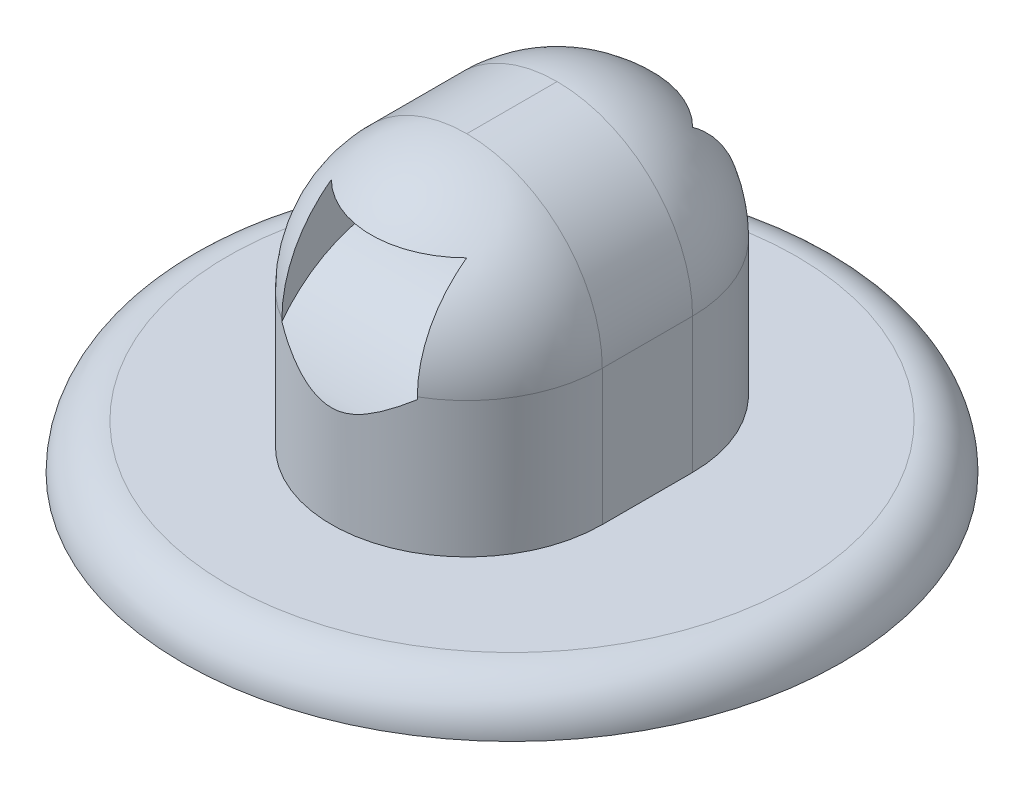
ISO-10303-21;
HEADER;
FILE_DESCRIPTION(('STEP AP214'),'2;1');
FILE_NAME('part.step','',(''),(''),'','','');
FILE_SCHEMA(('AUTOMOTIVE_DESIGN { 1 0 10303 214 1 1 1 1 }'));
ENDSEC;
DATA;
#1=APPLICATION_CONTEXT('core data for automotive mechanical design processes');
#2=APPLICATION_PROTOCOL_DEFINITION('international standard','automotive_design',2000,#1);
#3=PRODUCT_CONTEXT('',#1,'mechanical');
#4=PRODUCT('Part','Part','',(#3));
#5=PRODUCT_RELATED_PRODUCT_CATEGORY('part','',(#4));
#6=PRODUCT_DEFINITION_FORMATION('','',#4);
#7=PRODUCT_DEFINITION_CONTEXT('part definition',#1,'design');
#8=PRODUCT_DEFINITION('design','',#6,#7);
#9=PRODUCT_DEFINITION_SHAPE('','',#8);
#10=(LENGTH_UNIT() NAMED_UNIT(*) SI_UNIT(.MILLI.,.METRE.));
#11=(NAMED_UNIT(*) PLANE_ANGLE_UNIT() SI_UNIT($,.RADIAN.));
#12=(NAMED_UNIT(*) SI_UNIT($,.STERADIAN.) SOLID_ANGLE_UNIT());
#13=UNCERTAINTY_MEASURE_WITH_UNIT(LENGTH_MEASURE(1.E-05),#10,'distance_accuracy_value','');
#14=(GEOMETRIC_REPRESENTATION_CONTEXT(3) GLOBAL_UNCERTAINTY_ASSIGNED_CONTEXT((#13)) GLOBAL_UNIT_ASSIGNED_CONTEXT((#10,
#11,#12)) REPRESENTATION_CONTEXT('',''));
#15=CARTESIAN_POINT('',(0.,0.,0.));
#16=DIRECTION('',(0.,0.,1.));
#17=DIRECTION('',(1.,0.,0.));
#18=AXIS2_PLACEMENT_3D('',#15,#16,#17);
#19=CARTESIAN_POINT('',(0.,7.,-1.));
#20=DIRECTION('',(0.,-1.,0.));
#21=DIRECTION('',(0.,0.,-1.));
#22=AXIS2_PLACEMENT_3D('',#19,#20,#21);
#23=CYLINDRICAL_SURFACE('',#22,3.);
#24=CARTESIAN_POINT('',(-1.5,3.94593994659208,-3.59807621135332));
#25=CARTESIAN_POINT('',(-1.44826981636904,3.90706063885143,-3.62792778804019));
#26=CARTESIAN_POINT('',(-1.39566446401504,3.86816071643365,-3.65625443937541));
#27=CARTESIAN_POINT('',(-1.28845408672497,3.79084174820304,-3.70989014273295));
#28=CARTESIAN_POINT('',(-1.23384612256437,3.75242353012856,-3.73519450667385));
#29=CARTESIAN_POINT('',(-1.1213876922521,3.67592988541731,-3.78321786612008));
#30=CARTESIAN_POINT('',(-1.06349352493496,3.63787797772951,-3.80587257449114));
#31=CARTESIAN_POINT('',(-0.94525009393945,3.5639001721541,-3.84788273287816));
#32=CARTESIAN_POINT('',(-0.884902526287782,3.52797284634619,-3.86724041564458));
#33=CARTESIAN_POINT('',(-0.747931455534948,3.45212442141335,-3.90632441942961));
#34=CARTESIAN_POINT('',(-0.670607943908631,3.41301691306116,-3.92522720004932));
#35=CARTESIAN_POINT('',(-0.511182597435,3.34378067085881,-3.95723585241046));
#36=CARTESIAN_POINT('',(-0.429109302444175,3.31360385821411,-3.97037295593166));
#37=CARTESIAN_POINT('',(-0.280337547626797,3.27305469387464,-3.98757189195487));
#38=CARTESIAN_POINT('',(-0.214659283614273,3.25967130472389,-3.99305308994888));
#39=CARTESIAN_POINT('',(-0.0818445836559841,3.24357543365391,-3.99961622690649));
#40=CARTESIAN_POINT('',(-0.0147115136858891,3.24084051511601,-4.00070741590084));
#41=CARTESIAN_POINT('',(0.118943728930403,3.2465752407274,-3.99838715258133));
#42=CARTESIAN_POINT('',(0.185466070807313,3.25504168049184,-3.99497698797528));
#43=CARTESIAN_POINT('',(0.316315988916615,3.28150750258251,-3.9840041023668));
#44=CARTESIAN_POINT('',(0.38063651862191,3.29953490796304,-3.97642917208912));
#45=CARTESIAN_POINT('',(0.554269162026864,3.35885075024621,-3.95048706726652));
#46=CARTESIAN_POINT('',(0.660444305623952,3.40739074693811,-3.92829559135371));
#47=CARTESIAN_POINT('',(0.864983392327674,3.51490910432467,-3.8745546438772));
#48=CARTESIAN_POINT('',(0.963305677499637,3.57393838450343,-3.84295899112842));
#49=CARTESIAN_POINT('',(1.13632817551879,3.68539098393196,-3.77770738330353));
#50=CARTESIAN_POINT('',(1.21206676500567,3.73705640068347,-3.74547744210933));
#51=CARTESIAN_POINT('',(1.35902498564422,3.84118032124855,-3.675729938851));
#52=CARTESIAN_POINT('',(1.43028632825628,3.89362304235902,-3.63827692696446));
#53=CARTESIAN_POINT('',(1.5,3.94593994659209,-3.59807621135331));
#54=B_SPLINE_CURVE_WITH_KNOTS('',3,(#24,#25,#26,#27,#28,#29,#30,#31,#32,#33,#34,#35,#36,#37,#38,
#39,#40,#41,#42,#43,#44,#45,#46,#47,#48,#49,#50,#51,#52,#53),.UNSPECIFIED.,.F.,.F.,(4,2,2,2,2,2,
2,2,2,2,2,2,2,2,4),(0.,0.213785520799058,0.427898467078382,0.646439268498249,0.864831480206887,
1.13039679797453,1.39450527954777,1.59541803210558,1.79590722617891,1.99633907848824,
2.19736166691576,2.55184057499459,2.90808978220661,3.19938444271308,3.48735434451648),.UNSPECIFIED.);
#55=CARTESIAN_POINT('',(-1.5,3.94593994659208,-3.59807621135332));
#56=VERTEX_POINT('',#55);
#57=CARTESIAN_POINT('',(1.5,3.94593994659209,-3.59807621135331));
#58=VERTEX_POINT('',#57);
#59=EDGE_CURVE('E11',#56,#58,#54,.T.);
#60=ORIENTED_EDGE('',*,*,#59,.T.);
#61=DIRECTION('',(0.,-1.,0.));
#62=VECTOR('',#61,1.);
#63=CARTESIAN_POINT('',(1.5,7.,-3.59807621135331));
#64=LINE('',#63,#62);
#65=CARTESIAN_POINT('',(1.5,4.,-3.59807621135331));
#66=VERTEX_POINT('',#65);
#67=EDGE_CURVE('E148',#58,#66,#64,.F.);
#68=ORIENTED_EDGE('',*,*,#67,.T.);
#69=CARTESIAN_POINT('',(0.,4.,-1.));
#70=DIRECTION('',(0.,-1.,0.));
#71=DIRECTION('',(0.,0.,-1.));
#72=AXIS2_PLACEMENT_3D('',#69,#70,#71);
#73=CIRCLE('',#72,3.);
#74=CARTESIAN_POINT('',(3.,4.,-1.));
#75=VERTEX_POINT('',#74);
#76=EDGE_CURVE('E245',#66,#75,#73,.T.);
#77=ORIENTED_EDGE('',*,*,#76,.T.);
#78=DIRECTION('',(0.,-1.,0.));
#79=VECTOR('',#78,1.);
#80=CARTESIAN_POINT('',(3.,7.,-1.));
#81=LINE('',#80,#79);
#82=CARTESIAN_POINT('',(3.,1.,-1.));
#83=VERTEX_POINT('',#82);
#84=EDGE_CURVE('E226',#75,#83,#81,.T.);
#85=ORIENTED_EDGE('',*,*,#84,.T.);
#86=CARTESIAN_POINT('',(0.,1.,-1.));
#87=DIRECTION('',(0.,1.,0.));
#88=DIRECTION('',(0.,0.,1.));
#89=AXIS2_PLACEMENT_3D('',#86,#87,#88);
#90=CIRCLE('',#89,3.);
#91=CARTESIAN_POINT('',(-3.,1.,-1.));
#92=VERTEX_POINT('',#91);
#93=EDGE_CURVE('E221',#83,#92,#90,.T.);
#94=ORIENTED_EDGE('',*,*,#93,.T.);
#95=DIRECTION('',(0.,-1.,0.));
#96=VECTOR('',#95,1.);
#97=CARTESIAN_POINT('',(-3.,7.,-1.));
#98=LINE('',#97,#96);
#99=CARTESIAN_POINT('',(-3.,4.,-1.));
#100=VERTEX_POINT('',#99);
#101=EDGE_CURVE('E230',#100,#92,#98,.T.);
#102=ORIENTED_EDGE('',*,*,#101,.F.);
#103=CARTESIAN_POINT('',(-1.5,4.,-3.59807621135332));
#104=VERTEX_POINT('',#103);
#105=EDGE_CURVE('E246',#100,#104,#73,.T.);
#106=ORIENTED_EDGE('',*,*,#105,.T.);
#107=DIRECTION('',(0.,-1.,0.));
#108=VECTOR('',#107,1.);
#109=CARTESIAN_POINT('',(-1.5,7.,-3.59807621135332));
#110=LINE('',#109,#108);
#111=EDGE_CURVE('E61',#56,#104,#110,.F.);
#112=ORIENTED_EDGE('',*,*,#111,.F.);
#113=EDGE_LOOP('',(#60,#68,#77,#85,#94,#102,#106,#112));
#114=FACE_BOUND('',#113,.T.);
#115=ADVANCED_FACE('F39',(#114),#23,.T.);
#116=CARTESIAN_POINT('',(0.,1.,0.));
#117=DIRECTION('',(0.,1.,0.));
#118=DIRECTION('',(0.,0.,1.));
#119=AXIS2_PLACEMENT_3D('',#116,#117,#118);
#120=PLANE('',#119);
#121=CARTESIAN_POINT('',(0.,1.,0.));
#122=DIRECTION('',(0.,1.,0.));
#123=DIRECTION('',(0.,0.,1.));
#124=AXIS2_PLACEMENT_3D('',#121,#122,#123);
#125=CIRCLE('',#124,6.3);
#126=CARTESIAN_POINT('',(0.,1.,6.3));
#127=VERTEX_POINT('',#126);
#128=EDGE_CURVE('E258',#127,#127,#125,.T.);
#129=ORIENTED_EDGE('',*,*,#128,.T.);
#130=EDGE_LOOP('',(#129));
#131=FACE_BOUND('',#130,.T.);
#132=ORIENTED_EDGE('',*,*,#93,.F.);
#133=DIRECTION('',(0.,0.,1.));
#134=VECTOR('',#133,1.);
#135=CARTESIAN_POINT('',(3.,1.,-1.));
#136=LINE('',#135,#134);
#137=CARTESIAN_POINT('',(3.,1.,1.));
#138=VERTEX_POINT('',#137);
#139=EDGE_CURVE('E208',#83,#138,#136,.T.);
#140=ORIENTED_EDGE('',*,*,#139,.T.);
#141=CARTESIAN_POINT('',(0.,1.,1.));
#142=DIRECTION('',(0.,1.,0.));
#143=DIRECTION('',(0.,0.,1.));
#144=AXIS2_PLACEMENT_3D('',#141,#142,#143);
#145=CIRCLE('',#144,3.);
#146=CARTESIAN_POINT('',(-3.,1.,1.));
#147=VERTEX_POINT('',#146);
#148=EDGE_CURVE('E212',#147,#138,#145,.T.);
#149=ORIENTED_EDGE('',*,*,#148,.F.);
#150=DIRECTION('',(0.,0.,1.));
#151=VECTOR('',#150,1.);
#152=CARTESIAN_POINT('',(-3.,1.,-1.));
#153=LINE('',#152,#151);
#154=EDGE_CURVE('E217',#92,#147,#153,.T.);
#155=ORIENTED_EDGE('',*,*,#154,.F.);
#156=EDGE_LOOP('',(#132,#140,#149,#155));
#157=FACE_BOUND('',#156,.T.);
#158=ADVANCED_FACE('F311',(#131,#157),#120,.T.);
#159=CARTESIAN_POINT('',(0.,0.,0.));
#160=DIRECTION('',(0.,1.,0.));
#161=DIRECTION('',(0.,0.,1.));
#162=AXIS2_PLACEMENT_3D('',#159,#160,#161);
#163=PLANE('',#162);
#164=CARTESIAN_POINT('',(0.,0.,0.));
#165=DIRECTION('',(0.,1.,0.));
#166=DIRECTION('',(0.,0.,1.));
#167=AXIS2_PLACEMENT_3D('',#164,#165,#166);
#168=CIRCLE('',#167,7.3);
#169=CARTESIAN_POINT('',(0.,0.,7.3));
#170=VERTEX_POINT('',#169);
#171=EDGE_CURVE('E229',#170,#170,#168,.T.);
#172=ORIENTED_EDGE('',*,*,#171,.F.);
#173=EDGE_LOOP('',(#172));
#174=FACE_BOUND('',#173,.T.);
#175=ADVANCED_FACE('F323',(#174),#163,.F.);
#176=CARTESIAN_POINT('',(3.,7.,-1.));
#177=DIRECTION('',(1.,0.,0.));
#178=DIRECTION('',(0.,0.,-1.));
#179=AXIS2_PLACEMENT_3D('',#176,#177,#178);
#180=PLANE('',#179);
#181=ORIENTED_EDGE('',*,*,#84,.F.);
#182=DIRECTION('',(0.,0.,1.));
#183=VECTOR('',#182,1.);
#184=CARTESIAN_POINT('',(3.,4.,-1.));
#185=LINE('',#184,#183);
#186=CARTESIAN_POINT('',(3.,4.,1.));
#187=VERTEX_POINT('',#186);
#188=EDGE_CURVE('E250',#75,#187,#185,.T.);
#189=ORIENTED_EDGE('',*,*,#188,.T.);
#190=DIRECTION('',(0.,-1.,0.));
#191=VECTOR('',#190,1.);
#192=CARTESIAN_POINT('',(3.,7.,1.));
#193=LINE('',#192,#191);
#194=EDGE_CURVE('E225',#187,#138,#193,.T.);
#195=ORIENTED_EDGE('',*,*,#194,.T.);
#196=ORIENTED_EDGE('',*,*,#139,.F.);
#197=EDGE_LOOP('',(#181,#189,#195,#196));
#198=FACE_BOUND('',#197,.T.);
#199=ADVANCED_FACE('F315',(#198),#180,.T.);
#200=CARTESIAN_POINT('',(-3.,7.,-1.));
#201=DIRECTION('',(1.,0.,0.));
#202=DIRECTION('',(0.,0.,-1.));
#203=AXIS2_PLACEMENT_3D('',#200,#201,#202);
#204=PLANE('',#203);
#205=DIRECTION('',(0.,-1.,0.));
#206=VECTOR('',#205,1.);
#207=CARTESIAN_POINT('',(-3.,7.,1.));
#208=LINE('',#207,#206);
#209=CARTESIAN_POINT('',(-3.,4.,1.));
#210=VERTEX_POINT('',#209);
#211=EDGE_CURVE('E233',#210,#147,#208,.T.);
#212=ORIENTED_EDGE('',*,*,#211,.F.);
#213=DIRECTION('',(0.,0.,1.));
#214=VECTOR('',#213,1.);
#215=CARTESIAN_POINT('',(-3.,4.,-1.));
#216=LINE('',#215,#214);
#217=EDGE_CURVE('E241',#210,#100,#216,.F.);
#218=ORIENTED_EDGE('',*,*,#217,.T.);
#219=ORIENTED_EDGE('',*,*,#101,.T.);
#220=ORIENTED_EDGE('',*,*,#154,.T.);
#221=EDGE_LOOP('',(#212,#218,#219,#220));
#222=FACE_BOUND('',#221,.T.);
#223=ADVANCED_FACE('F313',(#222),#204,.F.);
#224=CARTESIAN_POINT('',(0.,7.,1.));
#225=DIRECTION('',(0.,-1.,0.));
#226=DIRECTION('',(0.,0.,-1.));
#227=AXIS2_PLACEMENT_3D('',#224,#225,#226);
#228=CYLINDRICAL_SURFACE('',#227,3.);
#229=CARTESIAN_POINT('',(0.,4.,1.));
#230=DIRECTION('',(0.,-1.,0.));
#231=DIRECTION('',(0.,0.,-1.));
#232=AXIS2_PLACEMENT_3D('',#229,#230,#231);
#233=CIRCLE('',#232,3.);
#234=CARTESIAN_POINT('',(1.5,4.,3.59807621135332));
#235=VERTEX_POINT('',#234);
#236=EDGE_CURVE('E254',#187,#235,#233,.T.);
#237=ORIENTED_EDGE('',*,*,#236,.T.);
#238=DIRECTION('',(0.,-1.,0.));
#239=VECTOR('',#238,1.);
#240=CARTESIAN_POINT('',(1.5,7.,3.59807621135331));
#241=LINE('',#240,#239);
#242=CARTESIAN_POINT('',(1.5,3.94593994659209,3.59807621135331));
#243=VERTEX_POINT('',#242);
#244=EDGE_CURVE('E195',#235,#243,#241,.T.);
#245=ORIENTED_EDGE('',*,*,#244,.T.);
#246=CARTESIAN_POINT('',(1.5,3.94593994659209,3.59807621135331));
#247=CARTESIAN_POINT('',(1.44826981636904,3.90706063885143,3.62792778804019));
#248=CARTESIAN_POINT('',(1.39566446401504,3.86816071643365,3.65625443937541));
#249=CARTESIAN_POINT('',(1.28845408672497,3.79084174820304,3.70989014273295));
#250=CARTESIAN_POINT('',(1.23384612256438,3.75242353012856,3.73519450667385));
#251=CARTESIAN_POINT('',(1.1213876922521,3.67592988541731,3.78321786612008));
#252=CARTESIAN_POINT('',(1.06349352493496,3.63787797772951,3.80587257449114));
#253=CARTESIAN_POINT('',(0.945250093939452,3.5639001721541,3.84788273287816));
#254=CARTESIAN_POINT('',(0.884902526287784,3.52797284634619,3.86724041564458));
#255=CARTESIAN_POINT('',(0.74793145553495,3.45212442141335,3.9063244194296));
#256=CARTESIAN_POINT('',(0.670607943908634,3.41301691306116,3.92522720004932));
#257=CARTESIAN_POINT('',(0.511182597435002,3.34378067085881,3.95723585241046));
#258=CARTESIAN_POINT('',(0.429109302444176,3.31360385821412,3.97037295593166));
#259=CARTESIAN_POINT('',(0.280337547626798,3.27305469387465,3.98757189195487));
#260=CARTESIAN_POINT('',(0.214659283614274,3.25967130472389,3.99305308994888));
#261=CARTESIAN_POINT('',(0.0818445836559849,3.24357543365391,3.99961622690649));
#262=CARTESIAN_POINT('',(0.0147115136858897,3.24084051511601,4.00070741590084));
#263=CARTESIAN_POINT('',(-0.118943728930403,3.2465752407274,3.99838715258133));
#264=CARTESIAN_POINT('',(-0.185466070807313,3.25504168049184,3.99497698797528));
#265=CARTESIAN_POINT('',(-0.316315988916615,3.28150750258251,3.9840041023668));
#266=CARTESIAN_POINT('',(-0.38063651862191,3.29953490796304,3.97642917208912));
#267=CARTESIAN_POINT('',(-0.554269162026865,3.35885075024621,3.95048706726652));
#268=CARTESIAN_POINT('',(-0.660444305623953,3.40739074693811,3.92829559135371));
#269=CARTESIAN_POINT('',(-0.864983392327675,3.51490910432467,3.8745546438772));
#270=CARTESIAN_POINT('',(-0.963305677499638,3.57393838450343,3.84295899112842));
#271=CARTESIAN_POINT('',(-1.13632817551879,3.68539098393196,3.77770738330353));
#272=CARTESIAN_POINT('',(-1.21206676500567,3.73705640068347,3.74547744210933));
#273=CARTESIAN_POINT('',(-1.35902498564422,3.84118032124855,3.675729938851));
#274=CARTESIAN_POINT('',(-1.43028632825628,3.89362304235902,3.63827692696446));
#275=CARTESIAN_POINT('',(-1.5,3.94593994659209,3.59807621135332));
#276=B_SPLINE_CURVE_WITH_KNOTS('',3,(#246,#247,#248,#249,#250,#251,#252,#253,#254,#255,#256,
#257,#258,#259,#260,#261,#262,#263,#264,#265,#266,#267,#268,#269,#270,#271,#272,#273,#274,#275),
.UNSPECIFIED.,.F.,.F.,(4,2,2,2,2,2,2,2,2,2,2,2,2,2,4),(0.,0.213785520799058,0.427898467078383,
0.64643926849825,0.864831480206888,1.13039679797454,1.39450527954777,1.59541803210559,
1.79590722617892,1.99633907848824,2.19736166691576,2.5518405749946,2.90808978220661,
3.19938444271308,3.48735434451648),.UNSPECIFIED.);
#277=CARTESIAN_POINT('',(-1.5,3.94593994659209,3.59807621135332));
#278=VERTEX_POINT('',#277);
#279=EDGE_CURVE('E54',#243,#278,#276,.T.);
#280=ORIENTED_EDGE('',*,*,#279,.T.);
#281=DIRECTION('',(0.,-1.,0.));
#282=VECTOR('',#281,1.);
#283=CARTESIAN_POINT('',(-1.5,7.,3.59807621135332));
#284=LINE('',#283,#282);
#285=CARTESIAN_POINT('',(-1.5,4.,3.59807621135332));
#286=VERTEX_POINT('',#285);
#287=EDGE_CURVE('E186',#286,#278,#284,.T.);
#288=ORIENTED_EDGE('',*,*,#287,.F.);
#289=EDGE_CURVE('E253',#286,#210,#233,.T.);
#290=ORIENTED_EDGE('',*,*,#289,.T.);
#291=ORIENTED_EDGE('',*,*,#211,.T.);
#292=ORIENTED_EDGE('',*,*,#148,.T.);
#293=ORIENTED_EDGE('',*,*,#194,.F.);
#294=EDGE_LOOP('',(#237,#245,#280,#288,#290,#291,#292,#293));
#295=FACE_BOUND('',#294,.T.);
#296=ADVANCED_FACE('F294',(#295),#228,.T.);
#297=CARTESIAN_POINT('',(0.,4.,-1.));
#298=DIRECTION('',(0.,1.,0.));
#299=DIRECTION('',(0.,0.,1.));
#300=AXIS2_PLACEMENT_3D('',#297,#298,#299);
#301=SPHERICAL_SURFACE('',#300,3.);
#302=CARTESIAN_POINT('',(1.5,4.,-1.));
#303=DIRECTION('',(1.,0.,0.));
#304=DIRECTION('',(0.,0.,-1.));
#305=AXIS2_PLACEMENT_3D('',#302,#303,#304);
#306=CIRCLE('',#305,2.59807621135332);
#307=CARTESIAN_POINT('',(1.5,6.11945343909959,-2.50263672239465));
#308=VERTEX_POINT('',#307);
#309=EDGE_CURVE('E199',#308,#66,#306,.F.);
#310=ORIENTED_EDGE('',*,*,#309,.F.);
#311=CARTESIAN_POINT('',(0.,6.11945343909959,-1.));
#312=DIRECTION('',(0.,1.,0.));
#313=DIRECTION('',(0.,0.,1.));
#314=AXIS2_PLACEMENT_3D('',#311,#312,#313);
#315=CIRCLE('',#314,2.12318560646236);
#316=CARTESIAN_POINT('',(-1.5,6.11945343909959,-2.50263672239465));
#317=VERTEX_POINT('',#316);
#318=EDGE_CURVE('E204',#317,#308,#315,.F.);
#319=ORIENTED_EDGE('',*,*,#318,.F.);
#320=CARTESIAN_POINT('',(-1.5,4.,-1.));
#321=DIRECTION('',(1.,0.,0.));
#322=DIRECTION('',(0.,0.,-1.));
#323=AXIS2_PLACEMENT_3D('',#320,#321,#322);
#324=CIRCLE('',#323,2.59807621135332);
#325=EDGE_CURVE('E190',#317,#104,#324,.F.);
#326=ORIENTED_EDGE('',*,*,#325,.T.);
#327=ORIENTED_EDGE('',*,*,#105,.F.);
#328=CARTESIAN_POINT('',(0.,4.,-1.));
#329=DIRECTION('',(0.,0.,1.));
#330=DIRECTION('',(1.,0.,0.));
#331=AXIS2_PLACEMENT_3D('',#328,#329,#330);
#332=CIRCLE('',#331,3.);
#333=CARTESIAN_POINT('',(0.,7.,-1.));
#334=VERTEX_POINT('',#333);
#335=EDGE_CURVE('E266',#334,#100,#332,.T.);
#336=ORIENTED_EDGE('',*,*,#335,.F.);
#337=CARTESIAN_POINT('',(0.,4.,-1.));
#338=DIRECTION('',(0.,0.,1.));
#339=DIRECTION('',(1.,0.,0.));
#340=AXIS2_PLACEMENT_3D('',#337,#338,#339);
#341=CIRCLE('',#340,3.);
#342=EDGE_CURVE('E213',#75,#334,#341,.T.);
#343=ORIENTED_EDGE('',*,*,#342,.F.);
#344=ORIENTED_EDGE('',*,*,#76,.F.);
#345=EDGE_LOOP('',(#310,#319,#326,#327,#336,#343,#344));
#346=FACE_BOUND('',#345,.T.);
#347=ADVANCED_FACE('F321',(#346),#301,.T.);
#348=CARTESIAN_POINT('',(0.,4.,-1.));
#349=DIRECTION('',(0.,0.,1.));
#350=DIRECTION('',(1.,0.,0.));
#351=AXIS2_PLACEMENT_3D('',#348,#349,#350);
#352=CYLINDRICAL_SURFACE('',#351,3.);
#353=CARTESIAN_POINT('',(0.,4.,1.));
#354=DIRECTION('',(0.,0.,1.));
#355=DIRECTION('',(1.,0.,0.));
#356=AXIS2_PLACEMENT_3D('',#353,#354,#355);
#357=CIRCLE('',#356,3.);
#358=CARTESIAN_POINT('',(0.,7.,1.));
#359=VERTEX_POINT('',#358);
#360=EDGE_CURVE('E269',#187,#359,#357,.T.);
#361=ORIENTED_EDGE('',*,*,#360,.F.);
#362=ORIENTED_EDGE('',*,*,#188,.F.);
#363=ORIENTED_EDGE('',*,*,#342,.T.);
#364=DIRECTION('',(0.,0.,1.));
#365=VECTOR('',#364,1.);
#366=CARTESIAN_POINT('',(0.,7.,1.));
#367=LINE('',#366,#365);
#368=EDGE_CURVE('E262',#359,#334,#367,.F.);
#369=ORIENTED_EDGE('',*,*,#368,.F.);
#370=EDGE_LOOP('',(#361,#362,#363,#369));
#371=FACE_BOUND('',#370,.T.);
#372=ADVANCED_FACE('F344',(#371),#352,.T.);
#373=CARTESIAN_POINT('',(0.,4.,1.));
#374=DIRECTION('',(0.,1.,0.));
#375=DIRECTION('',(0.,0.,1.));
#376=AXIS2_PLACEMENT_3D('',#373,#374,#375);
#377=SPHERICAL_SURFACE('',#376,3.);
#378=CARTESIAN_POINT('',(1.5,4.,1.));
#379=DIRECTION('',(1.,0.,0.));
#380=DIRECTION('',(0.,0.,-1.));
#381=AXIS2_PLACEMENT_3D('',#378,#379,#380);
#382=CIRCLE('',#381,2.59807621135332);
#383=CARTESIAN_POINT('',(1.5,6.11945343909959,2.50263672239465));
#384=VERTEX_POINT('',#383);
#385=EDGE_CURVE('E284',#235,#384,#382,.F.);
#386=ORIENTED_EDGE('',*,*,#385,.F.);
#387=ORIENTED_EDGE('',*,*,#236,.F.);
#388=ORIENTED_EDGE('',*,*,#360,.T.);
#389=CARTESIAN_POINT('',(0.,4.,1.));
#390=DIRECTION('',(0.,0.,-1.));
#391=DIRECTION('',(-1.,0.,0.));
#392=AXIS2_PLACEMENT_3D('',#389,#390,#391);
#393=CIRCLE('',#392,3.);
#394=EDGE_CURVE('E207',#210,#359,#393,.T.);
#395=ORIENTED_EDGE('',*,*,#394,.F.);
#396=ORIENTED_EDGE('',*,*,#289,.F.);
#397=CARTESIAN_POINT('',(-1.5,4.,1.));
#398=DIRECTION('',(1.,0.,0.));
#399=DIRECTION('',(0.,0.,-1.));
#400=AXIS2_PLACEMENT_3D('',#397,#398,#399);
#401=CIRCLE('',#400,2.59807621135332);
#402=CARTESIAN_POINT('',(-1.5,6.11945343909959,2.50263672239465));
#403=VERTEX_POINT('',#402);
#404=EDGE_CURVE('E277',#286,#403,#401,.F.);
#405=ORIENTED_EDGE('',*,*,#404,.T.);
#406=CARTESIAN_POINT('',(0.,6.11945343909959,1.));
#407=DIRECTION('',(0.,1.,0.));
#408=DIRECTION('',(0.,0.,1.));
#409=AXIS2_PLACEMENT_3D('',#406,#407,#408);
#410=CIRCLE('',#409,2.12318560646236);
#411=EDGE_CURVE('E281',#384,#403,#410,.F.);
#412=ORIENTED_EDGE('',*,*,#411,.F.);
#413=EDGE_LOOP('',(#386,#387,#388,#395,#396,#405,#412));
#414=FACE_BOUND('',#413,.T.);
#415=ADVANCED_FACE('F338',(#414),#377,.T.);
#416=CARTESIAN_POINT('',(0.,4.,1.));
#417=DIRECTION('',(0.,0.,-1.));
#418=DIRECTION('',(-1.,0.,0.));
#419=AXIS2_PLACEMENT_3D('',#416,#417,#418);
#420=CYLINDRICAL_SURFACE('',#419,3.);
#421=ORIENTED_EDGE('',*,*,#335,.T.);
#422=ORIENTED_EDGE('',*,*,#217,.F.);
#423=ORIENTED_EDGE('',*,*,#394,.T.);
#424=ORIENTED_EDGE('',*,*,#368,.T.);
#425=EDGE_LOOP('',(#421,#422,#423,#424));
#426=FACE_BOUND('',#425,.T.);
#427=ADVANCED_FACE('F332',(#426),#420,.T.);
#428=CARTESIAN_POINT('',(0.,0.,0.));
#429=DIRECTION('',(0.,1.,0.));
#430=DIRECTION('',(0.,0.,1.));
#431=AXIS2_PLACEMENT_3D('',#428,#429,#430);
#432=TOROIDAL_SURFACE('',#431,6.3,1.);
#433=ORIENTED_EDGE('',*,*,#171,.T.);
#434=EDGE_LOOP('',(#433));
#435=FACE_BOUND('',#434,.T.);
#436=ORIENTED_EDGE('',*,*,#128,.F.);
#437=EDGE_LOOP('',(#436));
#438=FACE_BOUND('',#437,.T.);
#439=ADVANCED_FACE('F41',(#435,#438),#432,.T.);
#440=CARTESIAN_POINT('',(1.5,2.11945343909959,-1.21817137335078));
#441=DIRECTION('',(-1.,0.,0.));
#442=DIRECTION('',(0.,0.,1.));
#443=AXIS2_PLACEMENT_3D('',#440,#441,#442);
#444=CYLINDRICAL_SURFACE('',#443,3.);
#445=CARTESIAN_POINT('',(-1.5,2.11945343909959,-1.21817137335078));
#446=DIRECTION('',(1.,0.,0.));
#447=DIRECTION('',(0.,0.,-1.));
#448=AXIS2_PLACEMENT_3D('',#445,#446,#447);
#449=CIRCLE('',#448,3.);
#450=CARTESIAN_POINT('',(-1.5,5.11945343909959,-1.21817137335078));
#451=VERTEX_POINT('',#450);
#452=EDGE_CURVE('E155',#56,#451,#449,.T.);
#453=ORIENTED_EDGE('',*,*,#452,.T.);
#454=DIRECTION('',(-1.,0.,0.));
#455=VECTOR('',#454,1.);
#456=CARTESIAN_POINT('',(1.5,5.11945343909959,-1.21817137335078));
#457=LINE('',#456,#455);
#458=CARTESIAN_POINT('',(1.5,5.11945343909959,-1.21817137335078));
#459=VERTEX_POINT('',#458);
#460=EDGE_CURVE('E153',#459,#451,#457,.T.);
#461=ORIENTED_EDGE('',*,*,#460,.F.);
#462=CARTESIAN_POINT('',(1.5,2.11945343909959,-1.21817137335078));
#463=DIRECTION('',(1.,0.,0.));
#464=DIRECTION('',(0.,0.,-1.));
#465=AXIS2_PLACEMENT_3D('',#462,#463,#464);
#466=CIRCLE('',#465,3.);
#467=EDGE_CURVE('E141',#58,#459,#466,.T.);
#468=ORIENTED_EDGE('',*,*,#467,.F.);
#469=ORIENTED_EDGE('',*,*,#59,.F.);
#470=EDGE_LOOP('',(#453,#461,#468,#469));
#471=FACE_BOUND('',#470,.T.);
#472=ADVANCED_FACE('F154',(#471),#444,.T.);
#473=CARTESIAN_POINT('',(1.5,2.11945343909959,1.21817137335078));
#474=DIRECTION('',(-1.,0.,0.));
#475=DIRECTION('',(0.,0.,1.));
#476=AXIS2_PLACEMENT_3D('',#473,#474,#475);
#477=CYLINDRICAL_SURFACE('',#476,3.);
#478=CARTESIAN_POINT('',(1.5,2.11945343909959,1.21817137335078));
#479=DIRECTION('',(1.,0.,0.));
#480=DIRECTION('',(0.,0.,-1.));
#481=AXIS2_PLACEMENT_3D('',#478,#479,#480);
#482=CIRCLE('',#481,3.);
#483=CARTESIAN_POINT('',(1.5,5.11945343909959,1.21817137335078));
#484=VERTEX_POINT('',#483);
#485=EDGE_CURVE('E166',#484,#243,#482,.T.);
#486=ORIENTED_EDGE('',*,*,#485,.F.);
#487=DIRECTION('',(-1.,0.,0.));
#488=VECTOR('',#487,1.);
#489=CARTESIAN_POINT('',(1.5,5.11945343909959,1.21817137335078));
#490=LINE('',#489,#488);
#491=CARTESIAN_POINT('',(-1.5,5.11945343909959,1.21817137335078));
#492=VERTEX_POINT('',#491);
#493=EDGE_CURVE('E160',#484,#492,#490,.T.);
#494=ORIENTED_EDGE('',*,*,#493,.T.);
#495=CARTESIAN_POINT('',(-1.5,2.11945343909959,1.21817137335078));
#496=DIRECTION('',(1.,0.,0.));
#497=DIRECTION('',(0.,0.,-1.));
#498=AXIS2_PLACEMENT_3D('',#495,#496,#497);
#499=CIRCLE('',#498,3.);
#500=EDGE_CURVE('E179',#492,#278,#499,.T.);
#501=ORIENTED_EDGE('',*,*,#500,.T.);
#502=ORIENTED_EDGE('',*,*,#279,.F.);
#503=EDGE_LOOP('',(#486,#494,#501,#502));
#504=FACE_BOUND('',#503,.T.);
#505=ADVANCED_FACE('F298',(#504),#477,.T.);
#506=CARTESIAN_POINT('',(1.5,2.11945343909959,-1.21817137335078));
#507=DIRECTION('',(1.,0.,0.));
#508=DIRECTION('',(0.,0.,-1.));
#509=AXIS2_PLACEMENT_3D('',#506,#507,#508);
#510=PLANE('',#509);
#511=ORIENTED_EDGE('',*,*,#467,.T.);
#512=DIRECTION('',(0.,0.,1.));
#513=VECTOR('',#512,1.);
#514=CARTESIAN_POINT('',(1.5,5.11945343909959,-1.21817137335078));
#515=LINE('',#514,#513);
#516=EDGE_CURVE('E146',#459,#484,#515,.T.);
#517=ORIENTED_EDGE('',*,*,#516,.T.);
#518=ORIENTED_EDGE('',*,*,#485,.T.);
#519=ORIENTED_EDGE('',*,*,#244,.F.);
#520=ORIENTED_EDGE('',*,*,#385,.T.);
#521=DIRECTION('',(0.,0.,-1.));
#522=VECTOR('',#521,1.);
#523=CARTESIAN_POINT('',(1.5,6.11945343909959,-4.));
#524=LINE('',#523,#522);
#525=EDGE_CURVE('E161',#384,#308,#524,.T.);
#526=ORIENTED_EDGE('',*,*,#525,.T.);
#527=ORIENTED_EDGE('',*,*,#309,.T.);
#528=ORIENTED_EDGE('',*,*,#67,.F.);
#529=EDGE_LOOP('',(#511,#517,#518,#519,#520,#526,#527,#528));
#530=FACE_BOUND('',#529,.T.);
#531=ADVANCED_FACE('F143',(#530),#510,.F.);
#532=CARTESIAN_POINT('',(-1.5,2.11945343909959,-1.21817137335078));
#533=DIRECTION('',(1.,0.,0.));
#534=DIRECTION('',(0.,0.,-1.));
#535=AXIS2_PLACEMENT_3D('',#532,#533,#534);
#536=PLANE('',#535);
#537=ORIENTED_EDGE('',*,*,#111,.T.);
#538=ORIENTED_EDGE('',*,*,#325,.F.);
#539=DIRECTION('',(0.,0.,-1.));
#540=VECTOR('',#539,1.);
#541=CARTESIAN_POINT('',(-1.5,6.11945343909959,-4.));
#542=LINE('',#541,#540);
#543=EDGE_CURVE('E67',#403,#317,#542,.T.);
#544=ORIENTED_EDGE('',*,*,#543,.F.);
#545=ORIENTED_EDGE('',*,*,#404,.F.);
#546=ORIENTED_EDGE('',*,*,#287,.T.);
#547=ORIENTED_EDGE('',*,*,#500,.F.);
#548=DIRECTION('',(0.,0.,1.));
#549=VECTOR('',#548,1.);
#550=CARTESIAN_POINT('',(-1.5,5.11945343909959,-1.21817137335078));
#551=LINE('',#550,#549);
#552=EDGE_CURVE('E176',#451,#492,#551,.T.);
#553=ORIENTED_EDGE('',*,*,#552,.F.);
#554=ORIENTED_EDGE('',*,*,#452,.F.);
#555=EDGE_LOOP('',(#537,#538,#544,#545,#546,#547,#553,#554));
#556=FACE_BOUND('',#555,.T.);
#557=ADVANCED_FACE('F359',(#556),#536,.T.);
#558=CARTESIAN_POINT('',(1.5,6.11945343909959,-4.));
#559=DIRECTION('',(0.,1.,0.));
#560=DIRECTION('',(0.,0.,1.));
#561=AXIS2_PLACEMENT_3D('',#558,#559,#560);
#562=PLANE('',#561);
#563=ORIENTED_EDGE('',*,*,#318,.T.);
#564=ORIENTED_EDGE('',*,*,#525,.F.);
#565=ORIENTED_EDGE('',*,*,#411,.T.);
#566=ORIENTED_EDGE('',*,*,#543,.T.);
#567=EDGE_LOOP('',(#563,#564,#565,#566));
#568=FACE_BOUND('',#567,.T.);
#569=ADVANCED_FACE('F304',(#568),#562,.F.);
#570=CARTESIAN_POINT('',(1.5,5.11945343909959,-1.21817137335078));
#571=DIRECTION('',(0.,-1.,0.));
#572=DIRECTION('',(0.,0.,-1.));
#573=AXIS2_PLACEMENT_3D('',#570,#571,#572);
#574=PLANE('',#573);
#575=ORIENTED_EDGE('',*,*,#552,.T.);
#576=ORIENTED_EDGE('',*,*,#493,.F.);
#577=ORIENTED_EDGE('',*,*,#516,.F.);
#578=ORIENTED_EDGE('',*,*,#460,.T.);
#579=EDGE_LOOP('',(#575,#576,#577,#578));
#580=FACE_BOUND('',#579,.T.);
#581=ADVANCED_FACE('F163',(#580),#574,.F.);
#582=CLOSED_SHELL('',(#115,#158,#175,#199,#223,#296,#347,#372,#415,#427,#439,#472,#505,#531,
#557,#569,#581));
#583=MANIFOLD_SOLID_BREP('B2',#582);
#584=ADVANCED_BREP_SHAPE_REPRESENTATION('',(#18,#583),#14);
#585=SHAPE_DEFINITION_REPRESENTATION(#9,#584);
ENDSEC;
END-ISO-10303-21;
